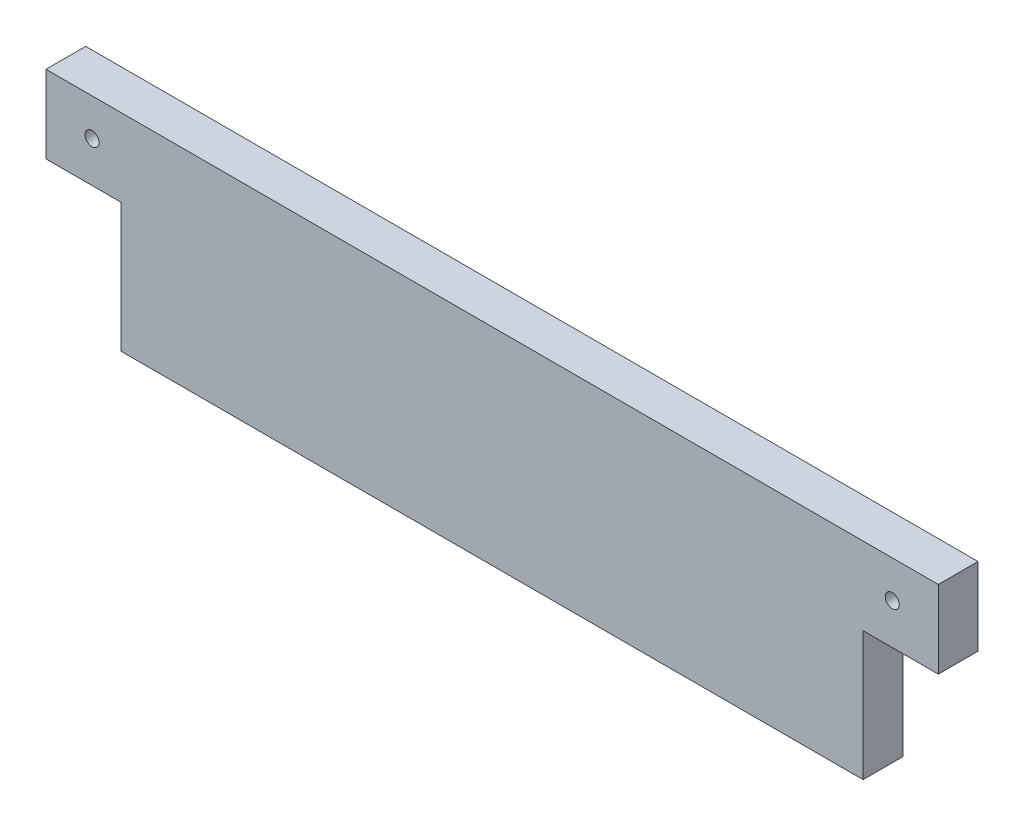
ISO-10303-21;
HEADER;
FILE_DESCRIPTION(('STEP AP214'),'2;1');
FILE_NAME('part.step','',(''),(''),'','','');
FILE_SCHEMA(('AUTOMOTIVE_DESIGN { 1 0 10303 214 1 1 1 1 }'));
ENDSEC;
DATA;
#1=APPLICATION_CONTEXT('core data for automotive mechanical design processes');
#2=APPLICATION_PROTOCOL_DEFINITION('international standard','automotive_design',2000,#1);
#3=PRODUCT_CONTEXT('',#1,'mechanical');
#4=PRODUCT('Part','Part','',(#3));
#5=PRODUCT_RELATED_PRODUCT_CATEGORY('part','',(#4));
#6=PRODUCT_DEFINITION_FORMATION('','',#4);
#7=PRODUCT_DEFINITION_CONTEXT('part definition',#1,'design');
#8=PRODUCT_DEFINITION('design','',#6,#7);
#9=PRODUCT_DEFINITION_SHAPE('','',#8);
#10=(LENGTH_UNIT() NAMED_UNIT(*) SI_UNIT(.MILLI.,.METRE.));
#11=(NAMED_UNIT(*) PLANE_ANGLE_UNIT() SI_UNIT($,.RADIAN.));
#12=(NAMED_UNIT(*) SI_UNIT($,.STERADIAN.) SOLID_ANGLE_UNIT());
#13=UNCERTAINTY_MEASURE_WITH_UNIT(LENGTH_MEASURE(1.E-05),#10,'distance_accuracy_value','');
#14=(GEOMETRIC_REPRESENTATION_CONTEXT(3) GLOBAL_UNCERTAINTY_ASSIGNED_CONTEXT((#13)) GLOBAL_UNIT_ASSIGNED_CONTEXT((#10,
#11,#12)) REPRESENTATION_CONTEXT('',''));
#15=CARTESIAN_POINT('',(0.,0.,0.));
#16=DIRECTION('',(0.,0.,1.));
#17=DIRECTION('',(1.,0.,0.));
#18=AXIS2_PLACEMENT_3D('',#15,#16,#17);
#19=CARTESIAN_POINT('',(458.976811329512,227.923866900524,0.));
#20=DIRECTION('',(0.,1.,0.));
#21=DIRECTION('',(-1.,0.,0.));
#22=AXIS2_PLACEMENT_3D('',#19,#20,#21);
#23=PLANE('',#22);
#24=DIRECTION('',(-1.,0.,0.));
#25=VECTOR('',#24,1.);
#26=CARTESIAN_POINT('',(458.976811329512,227.923866900524,3.94895762408587E-13));
#27=LINE('',#26,#25);
#28=CARTESIAN_POINT('',(25.0000000000001,227.923866900524,3.39495501973351E-13));
#29=VERTEX_POINT('',#28);
#30=CARTESIAN_POINT('',(-11.1125,227.923866900524,3.4576813310667E-13));
#31=VERTEX_POINT('',#30);
#32=EDGE_CURVE('E180',#29,#31,#27,.T.);
#33=ORIENTED_EDGE('',*,*,#32,.F.);
#34=DIRECTION('',(0.,0.,1.));
#35=VECTOR('',#34,1.);
#36=CARTESIAN_POINT('',(25.0000000000001,227.923866900524,2.64587082368404E-12));
#37=LINE('',#36,#35);
#38=CARTESIAN_POINT('',(25.0000000000001,227.923866900524,19.0499999999999));
#39=VERTEX_POINT('',#38);
#40=EDGE_CURVE('E150',#29,#39,#37,.T.);
#41=ORIENTED_EDGE('',*,*,#40,.T.);
#42=DIRECTION('',(-1.,0.,0.));
#43=VECTOR('',#42,1.);
#44=CARTESIAN_POINT('',(458.976811329512,227.923866900524,19.0500000000001));
#45=LINE('',#44,#43);
#46=CARTESIAN_POINT('',(-11.1125,227.923866900524,19.05));
#47=VERTEX_POINT('',#46);
#48=EDGE_CURVE('E128',#39,#47,#45,.T.);
#49=ORIENTED_EDGE('',*,*,#48,.T.);
#50=DIRECTION('',(0.,0.,-1.));
#51=VECTOR('',#50,1.);
#52=CARTESIAN_POINT('',(-11.1125,227.923866900524,0.));
#53=LINE('',#52,#51);
#54=EDGE_CURVE('E155',#47,#31,#53,.T.);
#55=ORIENTED_EDGE('',*,*,#54,.T.);
#56=EDGE_LOOP('',(#33,#41,#49,#55));
#57=FACE_BOUND('',#56,.T.);
#58=ADVANCED_FACE('F41',(#57),#23,.F.);
#59=CARTESIAN_POINT('',(417.11249999999,227.923866900524,19.0500000000001));
#60=VERTEX_POINT('',#59);
#61=CARTESIAN_POINT('',(381.,227.923866900524,19.0499999999998));
#62=VERTEX_POINT('',#61);
#63=EDGE_CURVE('E119',#60,#62,#45,.T.);
#64=ORIENTED_EDGE('',*,*,#63,.T.);
#65=DIRECTION('',(0.,0.,-1.));
#66=VECTOR('',#65,1.);
#67=CARTESIAN_POINT('',(381.,227.923866900524,2.58403470922336E-12));
#68=LINE('',#67,#66);
#69=CARTESIAN_POINT('',(381.,227.923866900524,3.86746638850965E-13));
#70=VERTEX_POINT('',#69);
#71=EDGE_CURVE('E106',#62,#70,#68,.T.);
#72=ORIENTED_EDGE('',*,*,#71,.T.);
#73=CARTESIAN_POINT('',(417.11249999999,227.923866900524,3.90520648321947E-13));
#74=VERTEX_POINT('',#73);
#75=EDGE_CURVE('E167',#74,#70,#27,.T.);
#76=ORIENTED_EDGE('',*,*,#75,.F.);
#77=DIRECTION('',(0.,0.,1.));
#78=VECTOR('',#77,1.);
#79=CARTESIAN_POINT('',(417.11249999999,227.923866900524,0.));
#80=LINE('',#79,#78);
#81=EDGE_CURVE('E50',#74,#60,#80,.T.);
#82=ORIENTED_EDGE('',*,*,#81,.T.);
#83=EDGE_LOOP('',(#64,#72,#76,#82));
#84=FACE_BOUND('',#83,.T.);
#85=ADVANCED_FACE('F43',(#84),#23,.F.);
#86=CARTESIAN_POINT('',(458.976811329512,0.,0.));
#87=DIRECTION('',(0.,0.,1.));
#88=DIRECTION('',(0.,-1.,0.));
#89=AXIS2_PLACEMENT_3D('',#86,#87,#88);
#90=PLANE('',#89);
#91=CARTESIAN_POINT('',(395.01449999999,247.422789405005,4.30211422042248E-13));
#92=DIRECTION('',(0.,0.,1.));
#93=DIRECTION('',(0.,-1.,0.));
#94=AXIS2_PLACEMENT_3D('',#91,#92,#93);
#95=CIRCLE('',#94,3.36549999999999);
#96=CARTESIAN_POINT('',(395.01449999999,250.788289405005,4.33680868994202E-13));
#97=VERTEX_POINT('',#96);
#98=EDGE_CURVE('E136',#97,#97,#95,.F.);
#99=ORIENTED_EDGE('',*,*,#98,.F.);
#100=EDGE_LOOP('',(#99));
#101=FACE_BOUND('',#100,.T.);
#102=CARTESIAN_POINT('',(10.9855,247.422789405005,3.88578058618805E-13));
#103=DIRECTION('',(0.,0.,1.));
#104=DIRECTION('',(0.,-1.,0.));
#105=AXIS2_PLACEMENT_3D('',#102,#103,#104);
#106=CIRCLE('',#105,3.36549999999999);
#107=CARTESIAN_POINT('',(10.9855,250.788289405005,3.92047505570758E-13));
#108=VERTEX_POINT('',#107);
#109=EDGE_CURVE('E124',#108,#108,#106,.T.);
#110=ORIENTED_EDGE('',*,*,#109,.T.);
#111=EDGE_LOOP('',(#110));
#112=FACE_BOUND('',#111,.T.);
#113=DIRECTION('',(-1.,0.,0.));
#114=VECTOR('',#113,1.);
#115=CARTESIAN_POINT('',(458.976811329512,265.202789405005,4.65461263536351E-13));
#116=LINE('',#115,#114);
#117=CARTESIAN_POINT('',(417.11249999999,265.202789405005,4.16333633520118E-13));
#118=VERTEX_POINT('',#117);
#119=CARTESIAN_POINT('',(-11.1125000000001,265.202789405005,4.16333634234434E-13));
#120=VERTEX_POINT('',#119);
#121=EDGE_CURVE('E130',#118,#120,#116,.T.);
#122=ORIENTED_EDGE('',*,*,#121,.F.);
#123=DIRECTION('',(0.,-1.,0.));
#124=VECTOR('',#123,1.);
#125=CARTESIAN_POINT('',(417.11249999999,0.,0.));
#126=LINE('',#125,#124);
#127=EDGE_CURVE('E66',#118,#74,#126,.T.);
#128=ORIENTED_EDGE('',*,*,#127,.T.);
#129=ORIENTED_EDGE('',*,*,#75,.T.);
#130=DIRECTION('',(0.,-1.,0.));
#131=VECTOR('',#130,1.);
#132=CARTESIAN_POINT('',(381.,0.,-6.81623405347893E-13));
#133=LINE('',#132,#131);
#134=CARTESIAN_POINT('',(381.,166.012618520992,0.));
#135=VERTEX_POINT('',#134);
#136=EDGE_CURVE('E58',#70,#135,#133,.T.);
#137=ORIENTED_EDGE('',*,*,#136,.T.);
#138=DIRECTION('',(1.,0.,0.));
#139=VECTOR('',#138,1.);
#140=CARTESIAN_POINT('',(-39.7758070263284,166.012618520992,0.));
#141=LINE('',#140,#139);
#142=CARTESIAN_POINT('',(25.0000000000001,166.012618520992,0.));
#143=VERTEX_POINT('',#142);
#144=EDGE_CURVE('E161',#143,#135,#141,.T.);
#145=ORIENTED_EDGE('',*,*,#144,.F.);
#146=DIRECTION('',(0.,1.,0.));
#147=VECTOR('',#146,1.);
#148=CARTESIAN_POINT('',(25.0000000000001,0.,-6.19787290887211E-13));
#149=LINE('',#148,#147);
#150=EDGE_CURVE('E147',#143,#29,#149,.T.);
#151=ORIENTED_EDGE('',*,*,#150,.T.);
#152=ORIENTED_EDGE('',*,*,#32,.T.);
#153=DIRECTION('',(0.,1.,0.));
#154=VECTOR('',#153,1.);
#155=CARTESIAN_POINT('',(-11.1125,0.,-1.09715251703541E-13));
#156=LINE('',#155,#154);
#157=EDGE_CURVE('E132',#31,#120,#156,.T.);
#158=ORIENTED_EDGE('',*,*,#157,.T.);
#159=EDGE_LOOP('',(#122,#128,#129,#137,#145,#151,#152,#158));
#160=FACE_BOUND('',#159,.T.);
#161=ADVANCED_FACE('F187',(#101,#112,#160),#90,.F.);
#162=CARTESIAN_POINT('',(458.976811329512,265.202789405005,0.));
#163=DIRECTION('',(0.,1.,0.));
#164=DIRECTION('',(-1.,0.,0.));
#165=AXIS2_PLACEMENT_3D('',#162,#163,#164);
#166=PLANE('',#165);
#167=DIRECTION('',(0.,0.,1.));
#168=VECTOR('',#167,1.);
#169=CARTESIAN_POINT('',(417.11249999999,265.202789405005,0.));
#170=LINE('',#169,#168);
#171=CARTESIAN_POINT('',(417.11249999999,265.202789405005,19.0500000000001));
#172=VERTEX_POINT('',#171);
#173=EDGE_CURVE('E165',#118,#172,#170,.T.);
#174=ORIENTED_EDGE('',*,*,#173,.F.);
#175=ORIENTED_EDGE('',*,*,#121,.T.);
#176=DIRECTION('',(0.,0.,-1.));
#177=VECTOR('',#176,1.);
#178=CARTESIAN_POINT('',(-11.1125000000001,265.202789405005,0.));
#179=LINE('',#178,#177);
#180=CARTESIAN_POINT('',(-11.1125000000001,265.202789405005,19.05));
#181=VERTEX_POINT('',#180);
#182=EDGE_CURVE('E175',#181,#120,#179,.T.);
#183=ORIENTED_EDGE('',*,*,#182,.F.);
#184=DIRECTION('',(-1.,0.,0.));
#185=VECTOR('',#184,1.);
#186=CARTESIAN_POINT('',(458.976811329512,265.202789405005,19.0500000000001));
#187=LINE('',#186,#185);
#188=EDGE_CURVE('E127',#172,#181,#187,.T.);
#189=ORIENTED_EDGE('',*,*,#188,.F.);
#190=EDGE_LOOP('',(#174,#175,#183,#189));
#191=FACE_BOUND('',#190,.T.);
#192=ADVANCED_FACE('F196',(#191),#166,.T.);
#193=CARTESIAN_POINT('',(458.976811329512,0.,19.0500000000001));
#194=DIRECTION('',(0.,0.,1.));
#195=DIRECTION('',(0.,-1.,0.));
#196=AXIS2_PLACEMENT_3D('',#193,#194,#195);
#197=PLANE('',#196);
#198=CARTESIAN_POINT('',(395.01449999999,247.422789405005,19.0500000000001));
#199=DIRECTION('',(0.,0.,1.));
#200=DIRECTION('',(0.,-1.,0.));
#201=AXIS2_PLACEMENT_3D('',#198,#199,#200);
#202=CIRCLE('',#201,3.36549999999999);
#203=CARTESIAN_POINT('',(395.01449999999,250.788289405005,19.05));
#204=VERTEX_POINT('',#203);
#205=EDGE_CURVE('E45',#204,#204,#202,.F.);
#206=ORIENTED_EDGE('',*,*,#205,.T.);
#207=EDGE_LOOP('',(#206));
#208=FACE_BOUND('',#207,.T.);
#209=CARTESIAN_POINT('',(10.9855,247.422789405005,19.05));
#210=DIRECTION('',(0.,0.,1.));
#211=DIRECTION('',(0.,-1.,0.));
#212=AXIS2_PLACEMENT_3D('',#209,#210,#211);
#213=CIRCLE('',#212,3.36549999999999);
#214=CARTESIAN_POINT('',(10.9855,250.788289405005,19.05));
#215=VERTEX_POINT('',#214);
#216=EDGE_CURVE('E134',#215,#215,#213,.T.);
#217=ORIENTED_EDGE('',*,*,#216,.F.);
#218=EDGE_LOOP('',(#217));
#219=FACE_BOUND('',#218,.T.);
#220=DIRECTION('',(0.,-1.,0.));
#221=VECTOR('',#220,1.);
#222=CARTESIAN_POINT('',(417.11249999999,0.,19.0500000000001));
#223=LINE('',#222,#221);
#224=EDGE_CURVE('E11',#172,#60,#223,.T.);
#225=ORIENTED_EDGE('',*,*,#224,.F.);
#226=ORIENTED_EDGE('',*,*,#188,.T.);
#227=DIRECTION('',(0.,1.,0.));
#228=VECTOR('',#227,1.);
#229=CARTESIAN_POINT('',(-11.1125,0.,19.0500000000001));
#230=LINE('',#229,#228);
#231=EDGE_CURVE('E172',#47,#181,#230,.T.);
#232=ORIENTED_EDGE('',*,*,#231,.F.);
#233=ORIENTED_EDGE('',*,*,#48,.F.);
#234=DIRECTION('',(0.,-1.,0.));
#235=VECTOR('',#234,1.);
#236=CARTESIAN_POINT('',(25.0000000000001,0.,19.0500000000005));
#237=LINE('',#236,#235);
#238=CARTESIAN_POINT('',(25.0000000000001,166.012618520992,19.05));
#239=VERTEX_POINT('',#238);
#240=EDGE_CURVE('E154',#39,#239,#237,.T.);
#241=ORIENTED_EDGE('',*,*,#240,.T.);
#242=DIRECTION('',(1.,0.,0.));
#243=VECTOR('',#242,1.);
#244=CARTESIAN_POINT('',(-39.7758070263284,166.012618520992,19.05));
#245=LINE('',#244,#243);
#246=CARTESIAN_POINT('',(381.,166.012618520992,19.0499999999999));
#247=VERTEX_POINT('',#246);
#248=EDGE_CURVE('E122',#239,#247,#245,.T.);
#249=ORIENTED_EDGE('',*,*,#248,.T.);
#250=DIRECTION('',(0.,1.,0.));
#251=VECTOR('',#250,1.);
#252=CARTESIAN_POINT('',(381.,0.,19.0500000000005));
#253=LINE('',#252,#251);
#254=EDGE_CURVE('E109',#247,#62,#253,.T.);
#255=ORIENTED_EDGE('',*,*,#254,.T.);
#256=ORIENTED_EDGE('',*,*,#63,.F.);
#257=EDGE_LOOP('',(#225,#226,#232,#233,#241,#249,#255,#256));
#258=FACE_BOUND('',#257,.T.);
#259=ADVANCED_FACE('F118',(#208,#219,#258),#197,.T.);
#260=CARTESIAN_POINT('',(-11.1125,0.,0.));
#261=DIRECTION('',(-1.,0.,0.));
#262=DIRECTION('',(0.,-1.,0.));
#263=AXIS2_PLACEMENT_3D('',#260,#261,#262);
#264=PLANE('',#263);
#265=ORIENTED_EDGE('',*,*,#54,.F.);
#266=ORIENTED_EDGE('',*,*,#231,.T.);
#267=ORIENTED_EDGE('',*,*,#182,.T.);
#268=ORIENTED_EDGE('',*,*,#157,.F.);
#269=EDGE_LOOP('',(#265,#266,#267,#268));
#270=FACE_BOUND('',#269,.T.);
#271=ADVANCED_FACE('F192',(#270),#264,.T.);
#272=CARTESIAN_POINT('',(417.11249999999,528.068905751241,-285.682288350271));
#273=DIRECTION('',(-1.,0.,0.));
#274=DIRECTION('',(0.,-0.640184399664488,0.768221279597369));
#275=AXIS2_PLACEMENT_3D('',#272,#273,#274);
#276=PLANE('',#275);
#277=ORIENTED_EDGE('',*,*,#127,.F.);
#278=ORIENTED_EDGE('',*,*,#173,.T.);
#279=ORIENTED_EDGE('',*,*,#224,.T.);
#280=ORIENTED_EDGE('',*,*,#81,.F.);
#281=EDGE_LOOP('',(#277,#278,#279,#280));
#282=FACE_BOUND('',#281,.T.);
#283=ADVANCED_FACE('F269',(#282),#276,.F.);
#284=CARTESIAN_POINT('',(381.,0.,0.));
#285=DIRECTION('',(-1.,0.,0.));
#286=DIRECTION('',(0.,0.,1.));
#287=AXIS2_PLACEMENT_3D('',#284,#285,#286);
#288=PLANE('',#287);
#289=ORIENTED_EDGE('',*,*,#254,.F.);
#290=DIRECTION('',(0.,0.,1.));
#291=VECTOR('',#290,1.);
#292=CARTESIAN_POINT('',(381.,166.012618520992,-1.52388758463288E-12));
#293=LINE('',#292,#291);
#294=EDGE_CURVE('E158',#135,#247,#293,.T.);
#295=ORIENTED_EDGE('',*,*,#294,.F.);
#296=ORIENTED_EDGE('',*,*,#136,.F.);
#297=ORIENTED_EDGE('',*,*,#71,.F.);
#298=EDGE_LOOP('',(#289,#295,#296,#297));
#299=FACE_BOUND('',#298,.T.);
#300=ADVANCED_FACE('F108',(#299),#288,.F.);
#301=CARTESIAN_POINT('',(-39.7758070263284,166.012618520992,-1.4508001100105E-12));
#302=DIRECTION('',(0.,1.,0.));
#303=DIRECTION('',(0.,0.,1.));
#304=AXIS2_PLACEMENT_3D('',#301,#302,#303);
#305=PLANE('',#304);
#306=ORIENTED_EDGE('',*,*,#248,.F.);
#307=DIRECTION('',(0.,0.,-1.));
#308=VECTOR('',#307,1.);
#309=CARTESIAN_POINT('',(25.0000000000001,166.012618520992,-1.4620514701722E-12));
#310=LINE('',#309,#308);
#311=EDGE_CURVE('E151',#239,#143,#310,.T.);
#312=ORIENTED_EDGE('',*,*,#311,.T.);
#313=ORIENTED_EDGE('',*,*,#144,.T.);
#314=ORIENTED_EDGE('',*,*,#294,.T.);
#315=EDGE_LOOP('',(#306,#312,#313,#314));
#316=FACE_BOUND('',#315,.T.);
#317=ADVANCED_FACE('F255',(#316),#305,.F.);
#318=CARTESIAN_POINT('',(25.0000000000002,887.010695877113,578.936997871986));
#319=DIRECTION('',(1.,0.,0.));
#320=DIRECTION('',(0.,-0.768221279597371,-0.640184399664486));
#321=AXIS2_PLACEMENT_3D('',#318,#319,#320);
#322=PLANE('',#321);
#323=ORIENTED_EDGE('',*,*,#40,.F.);
#324=ORIENTED_EDGE('',*,*,#150,.F.);
#325=ORIENTED_EDGE('',*,*,#311,.F.);
#326=ORIENTED_EDGE('',*,*,#240,.F.);
#327=EDGE_LOOP('',(#323,#324,#325,#326));
#328=FACE_BOUND('',#327,.T.);
#329=ADVANCED_FACE('F251',(#328),#322,.F.);
#330=CARTESIAN_POINT('',(10.9855,247.422789405005,23.4950000000002));
#331=DIRECTION('',(0.,0.,-1.));
#332=DIRECTION('',(0.,1.,0.));
#333=AXIS2_PLACEMENT_3D('',#330,#331,#332);
#334=CYLINDRICAL_SURFACE('',#333,3.36549999999999);
#335=CARTESIAN_POINT('',(10.9855,250.788289405005,19.05));
#336=CARTESIAN_POINT('',(10.9855,250.788289405005,18.8515625));
#337=CARTESIAN_POINT('',(10.9855,250.788289405005,18.653125));
#338=CARTESIAN_POINT('',(10.9855,250.788289405005,18.25625));
#339=CARTESIAN_POINT('',(10.9855,250.788289405005,18.0578125));
#340=CARTESIAN_POINT('',(10.9855,250.788289405005,17.6609375));
#341=CARTESIAN_POINT('',(10.9855,250.788289405005,17.4625));
#342=CARTESIAN_POINT('',(10.9855,250.788289405005,17.065625));
#343=CARTESIAN_POINT('',(10.9855,250.788289405005,16.8671875));
#344=CARTESIAN_POINT('',(10.9855,250.788289405005,16.4703125000001));
#345=CARTESIAN_POINT('',(10.9855,250.788289405005,16.2718750000001));
#346=CARTESIAN_POINT('',(10.9855,250.788289405005,15.8750000000001));
#347=CARTESIAN_POINT('',(10.9855,250.788289405005,15.6765625000001));
#348=CARTESIAN_POINT('',(10.9855,250.788289405005,15.2796875000001));
#349=CARTESIAN_POINT('',(10.9855,250.788289405005,15.0812500000001));
#350=CARTESIAN_POINT('',(10.9855,250.788289405005,14.6843750000001));
#351=CARTESIAN_POINT('',(10.9855,250.788289405005,14.4859375000001));
#352=CARTESIAN_POINT('',(10.9855,250.788289405005,14.0890625000001));
#353=CARTESIAN_POINT('',(10.9855,250.788289405005,13.8906250000001));
#354=CARTESIAN_POINT('',(10.9855,250.788289405005,13.4937500000001));
#355=CARTESIAN_POINT('',(10.9855,250.788289405005,13.2953125000001));
#356=CARTESIAN_POINT('',(10.9855,250.788289405005,12.8984375000001));
#357=CARTESIAN_POINT('',(10.9855,250.788289405005,12.7000000000001));
#358=CARTESIAN_POINT('',(10.9855,250.788289405005,12.3031250000001));
#359=CARTESIAN_POINT('',(10.9855,250.788289405005,12.1046875000001));
#360=CARTESIAN_POINT('',(10.9855,250.788289405005,11.7078125000002));
#361=CARTESIAN_POINT('',(10.9855,250.788289405005,11.5093750000002));
#362=CARTESIAN_POINT('',(10.9855,250.788289405005,11.1125000000002));
#363=CARTESIAN_POINT('',(10.9855,250.788289405005,10.9140625000002));
#364=CARTESIAN_POINT('',(10.9855,250.788289405005,10.5171875000002));
#365=CARTESIAN_POINT('',(10.9855,250.788289405005,10.3187500000002));
#366=CARTESIAN_POINT('',(10.9855,250.788289405005,9.92187500000019));
#367=CARTESIAN_POINT('',(10.9855,250.788289405005,9.72343750000019));
#368=CARTESIAN_POINT('',(10.9855,250.788289405005,9.3265625000002));
#369=CARTESIAN_POINT('',(10.9855,250.788289405005,9.1281250000002));
#370=CARTESIAN_POINT('',(10.9855,250.788289405005,8.73125000000021));
#371=CARTESIAN_POINT('',(10.9855,250.788289405005,8.53281250000022));
#372=CARTESIAN_POINT('',(10.9855,250.788289405005,8.13593750000023));
#373=CARTESIAN_POINT('',(10.9855,250.788289405005,7.93750000000023));
#374=CARTESIAN_POINT('',(10.9855,250.788289405005,7.54062500000024));
#375=CARTESIAN_POINT('',(10.9855,250.788289405005,7.34218750000024));
#376=CARTESIAN_POINT('',(10.9855,250.788289405005,6.94531250000025));
#377=CARTESIAN_POINT('',(10.9855,250.788289405005,6.74687500000025));
#378=CARTESIAN_POINT('',(10.9855,250.788289405005,6.35000000000026));
#379=CARTESIAN_POINT('',(10.9855,250.788289405005,6.15156250000027));
#380=CARTESIAN_POINT('',(10.9855,250.788289405005,5.75468750000028));
#381=CARTESIAN_POINT('',(10.9855,250.788289405005,5.55625000000028));
#382=CARTESIAN_POINT('',(10.9855,250.788289405005,5.15937500000029));
#383=CARTESIAN_POINT('',(10.9855,250.788289405005,4.96093750000029));
#384=CARTESIAN_POINT('',(10.9855,250.788289405005,4.5640625000003));
#385=CARTESIAN_POINT('',(10.9855,250.788289405005,4.3656250000003));
#386=CARTESIAN_POINT('',(10.9855,250.788289405005,3.96875000000031));
#387=CARTESIAN_POINT('',(10.9855,250.788289405005,3.77031250000031));
#388=CARTESIAN_POINT('',(10.9855,250.788289405005,3.37343750000032));
#389=CARTESIAN_POINT('',(10.9855,250.788289405005,3.17500000000033));
#390=CARTESIAN_POINT('',(10.9855,250.788289405005,2.77812500000034));
#391=CARTESIAN_POINT('',(10.9855,250.788289405005,2.57968750000034));
#392=CARTESIAN_POINT('',(10.9855,250.788289405005,2.18281250000035));
#393=CARTESIAN_POINT('',(10.9855,250.788289405005,1.98437500000035));
#394=CARTESIAN_POINT('',(10.9855,250.788289405005,1.58750000000036));
#395=CARTESIAN_POINT('',(10.9855,250.788289405005,1.38906250000036));
#396=CARTESIAN_POINT('',(10.9855,250.788289405005,0.992187500000369));
#397=CARTESIAN_POINT('',(10.9855,250.788289405005,0.793750000000374));
#398=CARTESIAN_POINT('',(10.9855,250.788289405005,0.396875000000383));
#399=CARTESIAN_POINT('',(10.9855,250.788289405005,0.198437500000388));
#400=CARTESIAN_POINT('',(10.9855,250.788289405005,3.92047505570758E-13));
#401=B_SPLINE_CURVE_WITH_KNOTS('',3,(#335,#336,#337,#338,#339,#340,#341,#342,#343,#344,#345,
#346,#347,#348,#349,#350,#351,#352,#353,#354,#355,#356,#357,#358,#359,#360,#361,#362,#363,#364,
#365,#366,#367,#368,#369,#370,#371,#372,#373,#374,#375,#376,#377,#378,#379,#380,#381,#382,#383,
#384,#385,#386,#387,#388,#389,#390,#391,#392,#393,#394,#395,#396,#397,#398,#399,#400),
.UNSPECIFIED.,.F.,.F.,(4,2,2,2,2,2,2,2,2,2,2,2,2,2,2,2,2,2,2,2,2,2,2,2,2,2,2,2,2,2,2,2,4),(0.,
0.595312499999986,1.19062499999997,1.78593749999996,2.38124999999995,2.97656249999994,
3.57187499999993,4.16718749999991,4.7624999999999,5.35781249999989,5.95312499999988,
6.54843749999987,7.14374999999986,7.73906249999984,8.33437499999983,8.92968749999982,
9.52499999999981,10.1203124999998,10.7156249999998,11.3109374999998,11.9062499999998,
12.5015624999997,13.0968749999997,13.6921874999997,14.2874999999997,14.8828124999997,
15.4781249999997,16.0734374999997,16.6687499999997,17.2640624999997,17.8593749999996,
18.4546874999996,19.0499999999996),.UNSPECIFIED.);
#402=EDGE_CURVE('BSEAM226',#215,#108,#401,.T.);
#403=ORIENTED_EDGE('',*,*,#216,.T.);
#404=ORIENTED_EDGE('',*,*,#109,.F.);
#405=ORIENTED_EDGE('',*,*,#402,.T.);
#406=ORIENTED_EDGE('',*,*,#402,.F.);
#407=EDGE_LOOP('',(#403,#405,#404,#406));
#408=FACE_BOUND('',#407,.T.);
#409=ADVANCED_FACE('F226',(#408),#334,.F.);
#410=CARTESIAN_POINT('',(395.01449999999,247.422789405005,23.4950000000002));
#411=DIRECTION('',(0.,0.,-1.));
#412=DIRECTION('',(0.,1.,0.));
#413=AXIS2_PLACEMENT_3D('',#410,#411,#412);
#414=CYLINDRICAL_SURFACE('',#413,3.36549999999999);
#415=CARTESIAN_POINT('',(395.01449999999,250.788289405005,19.05));
#416=CARTESIAN_POINT('',(395.01449999999,250.788289405005,18.8515625));
#417=CARTESIAN_POINT('',(395.01449999999,250.788289405005,18.6531250000001));
#418=CARTESIAN_POINT('',(395.01449999999,250.788289405005,18.2562500000001));
#419=CARTESIAN_POINT('',(395.01449999999,250.788289405005,18.0578125000001));
#420=CARTESIAN_POINT('',(395.01449999999,250.788289405005,17.6609375000001));
#421=CARTESIAN_POINT('',(395.01449999999,250.788289405005,17.4625000000001));
#422=CARTESIAN_POINT('',(395.01449999999,250.788289405005,17.0656250000001));
#423=CARTESIAN_POINT('',(395.01449999999,250.788289405005,16.8671875000001));
#424=CARTESIAN_POINT('',(395.01449999999,250.788289405005,16.4703125000001));
#425=CARTESIAN_POINT('',(395.01449999999,250.788289405005,16.2718750000001));
#426=CARTESIAN_POINT('',(395.01449999999,250.788289405005,15.8750000000001));
#427=CARTESIAN_POINT('',(395.01449999999,250.788289405005,15.6765625000001));
#428=CARTESIAN_POINT('',(395.01449999999,250.788289405005,15.2796875000001));
#429=CARTESIAN_POINT('',(395.01449999999,250.788289405005,15.0812500000001));
#430=CARTESIAN_POINT('',(395.01449999999,250.788289405005,14.6843750000001));
#431=CARTESIAN_POINT('',(395.01449999999,250.788289405005,14.4859375000001));
#432=CARTESIAN_POINT('',(395.01449999999,250.788289405005,14.0890625000001));
#433=CARTESIAN_POINT('',(395.01449999999,250.788289405005,13.8906250000002));
#434=CARTESIAN_POINT('',(395.01449999999,250.788289405005,13.4937500000002));
#435=CARTESIAN_POINT('',(395.01449999999,250.788289405005,13.2953125000002));
#436=CARTESIAN_POINT('',(395.01449999999,250.788289405005,12.8984375000002));
#437=CARTESIAN_POINT('',(395.01449999999,250.788289405005,12.7000000000002));
#438=CARTESIAN_POINT('',(395.01449999999,250.788289405005,12.3031250000002));
#439=CARTESIAN_POINT('',(395.01449999999,250.788289405005,12.1046875000002));
#440=CARTESIAN_POINT('',(395.01449999999,250.788289405005,11.7078125000002));
#441=CARTESIAN_POINT('',(395.01449999999,250.788289405005,11.5093750000002));
#442=CARTESIAN_POINT('',(395.01449999999,250.788289405005,11.1125000000002));
#443=CARTESIAN_POINT('',(395.01449999999,250.788289405005,10.9140625000002));
#444=CARTESIAN_POINT('',(395.01449999999,250.788289405005,10.5171875000002));
#445=CARTESIAN_POINT('',(395.01449999999,250.788289405005,10.3187500000002));
#446=CARTESIAN_POINT('',(395.01449999999,250.788289405005,9.92187500000023));
#447=CARTESIAN_POINT('',(395.01449999999,250.788289405005,9.72343750000024));
#448=CARTESIAN_POINT('',(395.01449999999,250.788289405005,9.32656250000024));
#449=CARTESIAN_POINT('',(395.01449999999,250.788289405005,9.12812500000025));
#450=CARTESIAN_POINT('',(395.01449999999,250.788289405005,8.73125000000026));
#451=CARTESIAN_POINT('',(395.01449999999,250.788289405005,8.53281250000026));
#452=CARTESIAN_POINT('',(395.01449999999,250.788289405005,8.13593750000027));
#453=CARTESIAN_POINT('',(395.01449999999,250.788289405005,7.93750000000027));
#454=CARTESIAN_POINT('',(395.01449999999,250.788289405005,7.54062500000028));
#455=CARTESIAN_POINT('',(395.01449999999,250.788289405005,7.34218750000028));
#456=CARTESIAN_POINT('',(395.01449999999,250.788289405005,6.94531250000029));
#457=CARTESIAN_POINT('',(395.01449999999,250.788289405005,6.74687500000029));
#458=CARTESIAN_POINT('',(395.01449999999,250.788289405005,6.3500000000003));
#459=CARTESIAN_POINT('',(395.01449999999,250.788289405005,6.15156250000031));
#460=CARTESIAN_POINT('',(395.01449999999,250.788289405005,5.75468750000032));
#461=CARTESIAN_POINT('',(395.01449999999,250.788289405005,5.55625000000032));
#462=CARTESIAN_POINT('',(395.01449999999,250.788289405005,5.15937500000033));
#463=CARTESIAN_POINT('',(395.01449999999,250.788289405005,4.96093750000033));
#464=CARTESIAN_POINT('',(395.01449999999,250.788289405005,4.56406250000034));
#465=CARTESIAN_POINT('',(395.01449999999,250.788289405005,4.36562500000034));
#466=CARTESIAN_POINT('',(395.01449999999,250.788289405005,3.96875000000035));
#467=CARTESIAN_POINT('',(395.01449999999,250.788289405005,3.77031250000036));
#468=CARTESIAN_POINT('',(395.01449999999,250.788289405005,3.37343750000036));
#469=CARTESIAN_POINT('',(395.01449999999,250.788289405005,3.17500000000037));
#470=CARTESIAN_POINT('',(395.01449999999,250.788289405005,2.77812500000038));
#471=CARTESIAN_POINT('',(395.01449999999,250.788289405005,2.57968750000038));
#472=CARTESIAN_POINT('',(395.01449999999,250.788289405005,2.18281250000039));
#473=CARTESIAN_POINT('',(395.01449999999,250.788289405005,1.98437500000039));
#474=CARTESIAN_POINT('',(395.01449999999,250.788289405005,1.5875000000004));
#475=CARTESIAN_POINT('',(395.01449999999,250.788289405005,1.3890625000004));
#476=CARTESIAN_POINT('',(395.01449999999,250.788289405005,0.992187500000411));
#477=CARTESIAN_POINT('',(395.01449999999,250.788289405005,0.793750000000416));
#478=CARTESIAN_POINT('',(395.01449999999,250.788289405005,0.396875000000425));
#479=CARTESIAN_POINT('',(395.01449999999,250.788289405005,0.198437500000429));
#480=CARTESIAN_POINT('',(395.01449999999,250.788289405005,4.33680868994202E-13));
#481=B_SPLINE_CURVE_WITH_KNOTS('',3,(#415,#416,#417,#418,#419,#420,#421,#422,#423,#424,#425,
#426,#427,#428,#429,#430,#431,#432,#433,#434,#435,#436,#437,#438,#439,#440,#441,#442,#443,#444,
#445,#446,#447,#448,#449,#450,#451,#452,#453,#454,#455,#456,#457,#458,#459,#460,#461,#462,#463,
#464,#465,#466,#467,#468,#469,#470,#471,#472,#473,#474,#475,#476,#477,#478,#479,#480),
.UNSPECIFIED.,.F.,.F.,(4,2,2,2,2,2,2,2,2,2,2,2,2,2,2,2,2,2,2,2,2,2,2,2,2,2,2,2,2,2,2,2,4),(0.,
0.595312499999986,1.19062499999997,1.78593749999996,2.38124999999995,2.97656249999994,
3.57187499999993,4.16718749999991,4.7624999999999,5.35781249999989,5.95312499999988,
6.54843749999987,7.14374999999986,7.73906249999984,8.33437499999983,8.92968749999982,
9.52499999999981,10.1203124999998,10.7156249999998,11.3109374999998,11.9062499999998,
12.5015624999997,13.0968749999997,13.6921874999997,14.2874999999997,14.8828124999997,
15.4781249999997,16.0734374999997,16.6687499999997,17.2640624999997,17.8593749999996,
18.4546874999996,19.0499999999996),.UNSPECIFIED.);
#482=EDGE_CURVE('BSEAM239',#204,#97,#481,.T.);
#483=ORIENTED_EDGE('',*,*,#205,.F.);
#484=ORIENTED_EDGE('',*,*,#98,.T.);
#485=ORIENTED_EDGE('',*,*,#482,.T.);
#486=ORIENTED_EDGE('',*,*,#482,.F.);
#487=EDGE_LOOP('',(#483,#485,#484,#486));
#488=FACE_BOUND('',#487,.T.);
#489=ADVANCED_FACE('F239',(#488),#414,.F.);
#490=CLOSED_SHELL('',(#58,#85,#161,#192,#259,#271,#283,#300,#317,#329,#409,#489));
#491=MANIFOLD_SOLID_BREP('B2',#490);
#492=ADVANCED_BREP_SHAPE_REPRESENTATION('',(#18,#491),#14);
#493=SHAPE_DEFINITION_REPRESENTATION(#9,#492);
ENDSEC;
END-ISO-10303-21;
